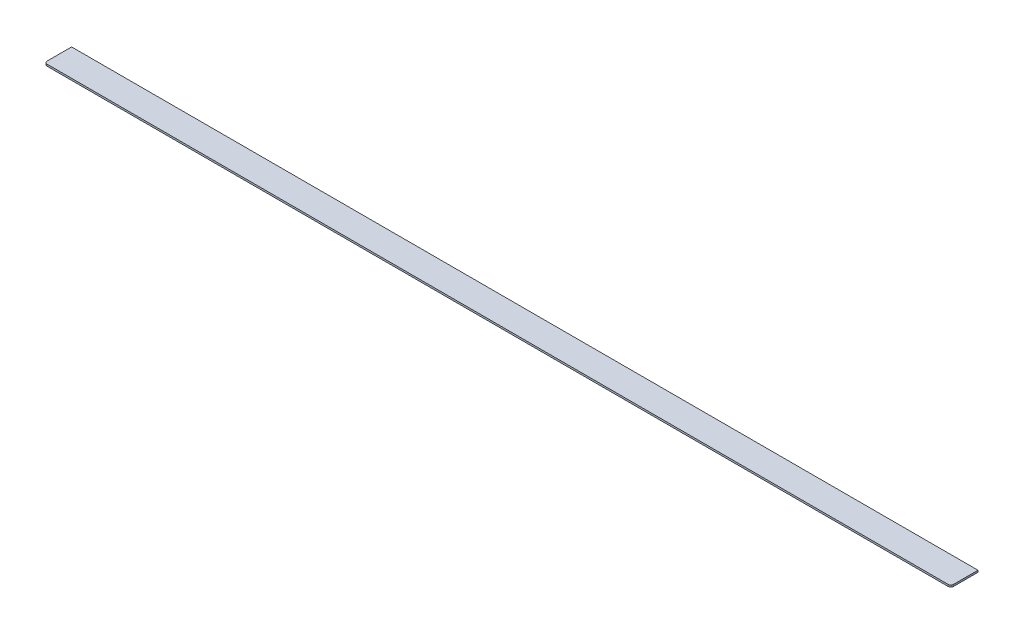
ISO-10303-21;
HEADER;
FILE_DESCRIPTION(('STEP AP214'),'2;1');
FILE_NAME('part.step','',(''),(''),'','','');
FILE_SCHEMA(('AUTOMOTIVE_DESIGN { 1 0 10303 214 1 1 1 1 }'));
ENDSEC;
DATA;
#1=APPLICATION_CONTEXT('core data for automotive mechanical design processes');
#2=APPLICATION_PROTOCOL_DEFINITION('international standard','automotive_design',2000,#1);
#3=PRODUCT_CONTEXT('',#1,'mechanical');
#4=PRODUCT('Part','Part','',(#3));
#5=PRODUCT_RELATED_PRODUCT_CATEGORY('part','',(#4));
#6=PRODUCT_DEFINITION_FORMATION('','',#4);
#7=PRODUCT_DEFINITION_CONTEXT('part definition',#1,'design');
#8=PRODUCT_DEFINITION('design','',#6,#7);
#9=PRODUCT_DEFINITION_SHAPE('','',#8);
#10=(LENGTH_UNIT() NAMED_UNIT(*) SI_UNIT(.MILLI.,.METRE.));
#11=(NAMED_UNIT(*) PLANE_ANGLE_UNIT() SI_UNIT($,.RADIAN.));
#12=(NAMED_UNIT(*) SI_UNIT($,.STERADIAN.) SOLID_ANGLE_UNIT());
#13=UNCERTAINTY_MEASURE_WITH_UNIT(LENGTH_MEASURE(1.E-05),#10,'distance_accuracy_value','');
#14=(GEOMETRIC_REPRESENTATION_CONTEXT(3) GLOBAL_UNCERTAINTY_ASSIGNED_CONTEXT((#13)) GLOBAL_UNIT_ASSIGNED_CONTEXT((#10,
#11,#12)) REPRESENTATION_CONTEXT('',''));
#15=CARTESIAN_POINT('',(0.,0.,0.));
#16=DIRECTION('',(0.,0.,1.));
#17=DIRECTION('',(1.,0.,0.));
#18=AXIS2_PLACEMENT_3D('',#15,#16,#17);
#19=CARTESIAN_POINT('',(1000.,-2.,-3.00000000000002));
#20=DIRECTION('',(1.,0.,0.));
#21=DIRECTION('',(0.,0.,-1.));
#22=AXIS2_PLACEMENT_3D('',#19,#20,#21);
#23=PLANE('',#22);
#24=DIRECTION('',(0.,0.,-1.));
#25=VECTOR('',#24,1.);
#26=CARTESIAN_POINT('',(1000.,0.,-3.00000000000002));
#27=LINE('',#26,#25);
#28=CARTESIAN_POINT('',(1000.,0.,-3.00000000000002));
#29=VERTEX_POINT('',#28);
#30=CARTESIAN_POINT('',(1000.,0.,-30.));
#31=VERTEX_POINT('',#30);
#32=EDGE_CURVE('E129',#29,#31,#27,.T.);
#33=ORIENTED_EDGE('',*,*,#32,.F.);
#34=DIRECTION('',(0.,1.,0.));
#35=VECTOR('',#34,1.);
#36=CARTESIAN_POINT('',(1000.,-2.,-3.00000000000002));
#37=LINE('',#36,#35);
#38=CARTESIAN_POINT('',(1000.,-2.,-3.00000000000002));
#39=VERTEX_POINT('',#38);
#40=EDGE_CURVE('E11',#39,#29,#37,.T.);
#41=ORIENTED_EDGE('',*,*,#40,.F.);
#42=DIRECTION('',(0.,0.,-1.));
#43=VECTOR('',#42,1.);
#44=CARTESIAN_POINT('',(1000.,-2.,-3.00000000000002));
#45=LINE('',#44,#43);
#46=CARTESIAN_POINT('',(1000.,-2.,-30.));
#47=VERTEX_POINT('',#46);
#48=EDGE_CURVE('E143',#39,#47,#45,.T.);
#49=ORIENTED_EDGE('',*,*,#48,.T.);
#50=DIRECTION('',(0.,1.,0.));
#51=VECTOR('',#50,1.);
#52=CARTESIAN_POINT('',(1000.,-2.,-30.));
#53=LINE('',#52,#51);
#54=EDGE_CURVE('E47',#47,#31,#53,.T.);
#55=ORIENTED_EDGE('',*,*,#54,.T.);
#56=EDGE_LOOP('',(#33,#41,#49,#55));
#57=FACE_BOUND('',#56,.T.);
#58=ADVANCED_FACE('F44',(#57),#23,.T.);
#59=CARTESIAN_POINT('',(997.,-2.,-3.));
#60=DIRECTION('',(0.,1.,0.));
#61=DIRECTION('',(0.,0.,1.));
#62=AXIS2_PLACEMENT_3D('',#59,#60,#61);
#63=CYLINDRICAL_SURFACE('',#62,3.);
#64=CARTESIAN_POINT('',(997.,0.,-3.));
#65=DIRECTION('',(0.,1.,0.));
#66=DIRECTION('',(0.,0.,1.));
#67=AXIS2_PLACEMENT_3D('',#64,#65,#66);
#68=CIRCLE('',#67,3.);
#69=CARTESIAN_POINT('',(997.,0.,0.));
#70=VERTEX_POINT('',#69);
#71=EDGE_CURVE('E141',#70,#29,#68,.T.);
#72=ORIENTED_EDGE('',*,*,#71,.F.);
#73=DIRECTION('',(0.,1.,0.));
#74=VECTOR('',#73,1.);
#75=CARTESIAN_POINT('',(997.,-2.,0.));
#76=LINE('',#75,#74);
#77=CARTESIAN_POINT('',(997.,-2.,0.));
#78=VERTEX_POINT('',#77);
#79=EDGE_CURVE('E53',#78,#70,#76,.T.);
#80=ORIENTED_EDGE('',*,*,#79,.F.);
#81=CARTESIAN_POINT('',(997.,-2.,-3.));
#82=DIRECTION('',(0.,1.,0.));
#83=DIRECTION('',(0.,0.,1.));
#84=AXIS2_PLACEMENT_3D('',#81,#82,#83);
#85=CIRCLE('',#84,3.);
#86=EDGE_CURVE('E119',#78,#39,#85,.T.);
#87=ORIENTED_EDGE('',*,*,#86,.T.);
#88=ORIENTED_EDGE('',*,*,#40,.T.);
#89=EDGE_LOOP('',(#72,#80,#87,#88));
#90=FACE_BOUND('',#89,.T.);
#91=ADVANCED_FACE('F151',(#90),#63,.T.);
#92=CARTESIAN_POINT('',(3.00000000000002,-2.,0.));
#93=DIRECTION('',(0.,0.,1.));
#94=DIRECTION('',(1.,0.,0.));
#95=AXIS2_PLACEMENT_3D('',#92,#93,#94);
#96=PLANE('',#95);
#97=DIRECTION('',(1.,0.,0.));
#98=VECTOR('',#97,1.);
#99=CARTESIAN_POINT('',(3.00000000000002,0.,0.));
#100=LINE('',#99,#98);
#101=CARTESIAN_POINT('',(3.00000000000002,0.,0.));
#102=VERTEX_POINT('',#101);
#103=EDGE_CURVE('E106',#102,#70,#100,.T.);
#104=ORIENTED_EDGE('',*,*,#103,.F.);
#105=DIRECTION('',(0.,1.,0.));
#106=VECTOR('',#105,1.);
#107=CARTESIAN_POINT('',(3.00000000000002,-2.,0.));
#108=LINE('',#107,#106);
#109=CARTESIAN_POINT('',(3.00000000000002,-2.,0.));
#110=VERTEX_POINT('',#109);
#111=EDGE_CURVE('E101',#110,#102,#108,.T.);
#112=ORIENTED_EDGE('',*,*,#111,.F.);
#113=DIRECTION('',(1.,0.,0.));
#114=VECTOR('',#113,1.);
#115=CARTESIAN_POINT('',(3.00000000000002,-2.,0.));
#116=LINE('',#115,#114);
#117=EDGE_CURVE('E104',#110,#78,#116,.T.);
#118=ORIENTED_EDGE('',*,*,#117,.T.);
#119=ORIENTED_EDGE('',*,*,#79,.T.);
#120=EDGE_LOOP('',(#104,#112,#118,#119));
#121=FACE_BOUND('',#120,.T.);
#122=ADVANCED_FACE('F103',(#121),#96,.T.);
#123=CARTESIAN_POINT('',(3.,-2.,-3.));
#124=DIRECTION('',(0.,1.,0.));
#125=DIRECTION('',(0.,0.,1.));
#126=AXIS2_PLACEMENT_3D('',#123,#124,#125);
#127=CYLINDRICAL_SURFACE('',#126,3.);
#128=CARTESIAN_POINT('',(3.,0.,-3.));
#129=DIRECTION('',(0.,1.,0.));
#130=DIRECTION('',(0.,0.,-1.));
#131=AXIS2_PLACEMENT_3D('',#128,#129,#130);
#132=CIRCLE('',#131,3.);
#133=CARTESIAN_POINT('',(0.,0.,-3.00000000000002));
#134=VERTEX_POINT('',#133);
#135=EDGE_CURVE('E138',#134,#102,#132,.T.);
#136=ORIENTED_EDGE('',*,*,#135,.F.);
#137=DIRECTION('',(0.,1.,0.));
#138=VECTOR('',#137,1.);
#139=CARTESIAN_POINT('',(0.,-2.,-3.00000000000002));
#140=LINE('',#139,#138);
#141=CARTESIAN_POINT('',(0.,-2.,-3.00000000000002));
#142=VERTEX_POINT('',#141);
#143=EDGE_CURVE('E111',#142,#134,#140,.T.);
#144=ORIENTED_EDGE('',*,*,#143,.F.);
#145=CARTESIAN_POINT('',(3.,-2.,-3.));
#146=DIRECTION('',(0.,1.,0.));
#147=DIRECTION('',(0.,0.,-1.));
#148=AXIS2_PLACEMENT_3D('',#145,#146,#147);
#149=CIRCLE('',#148,3.);
#150=EDGE_CURVE('E117',#142,#110,#149,.T.);
#151=ORIENTED_EDGE('',*,*,#150,.T.);
#152=ORIENTED_EDGE('',*,*,#111,.T.);
#153=EDGE_LOOP('',(#136,#144,#151,#152));
#154=FACE_BOUND('',#153,.T.);
#155=ADVANCED_FACE('F121',(#154),#127,.T.);
#156=CARTESIAN_POINT('',(0.,-2.,-3.00000000000002));
#157=DIRECTION('',(-1.,0.,0.));
#158=DIRECTION('',(0.,0.,1.));
#159=AXIS2_PLACEMENT_3D('',#156,#157,#158);
#160=PLANE('',#159);
#161=DIRECTION('',(0.,0.,1.));
#162=VECTOR('',#161,1.);
#163=CARTESIAN_POINT('',(0.,0.,-3.00000000000002));
#164=LINE('',#163,#162);
#165=CARTESIAN_POINT('',(0.,0.,-30.));
#166=VERTEX_POINT('',#165);
#167=EDGE_CURVE('E135',#166,#134,#164,.T.);
#168=ORIENTED_EDGE('',*,*,#167,.F.);
#169=DIRECTION('',(0.,1.,0.));
#170=VECTOR('',#169,1.);
#171=CARTESIAN_POINT('',(0.,-2.,-30.));
#172=LINE('',#171,#170);
#173=CARTESIAN_POINT('',(0.,-2.,-30.));
#174=VERTEX_POINT('',#173);
#175=EDGE_CURVE('E146',#174,#166,#172,.T.);
#176=ORIENTED_EDGE('',*,*,#175,.F.);
#177=DIRECTION('',(0.,0.,1.));
#178=VECTOR('',#177,1.);
#179=CARTESIAN_POINT('',(0.,-2.,-3.00000000000002));
#180=LINE('',#179,#178);
#181=EDGE_CURVE('E122',#174,#142,#180,.T.);
#182=ORIENTED_EDGE('',*,*,#181,.T.);
#183=ORIENTED_EDGE('',*,*,#143,.T.);
#184=EDGE_LOOP('',(#168,#176,#182,#183));
#185=FACE_BOUND('',#184,.T.);
#186=ADVANCED_FACE('F164',(#185),#160,.T.);
#187=CARTESIAN_POINT('',(0.,-2.,-30.));
#188=DIRECTION('',(0.,0.,-1.));
#189=DIRECTION('',(-1.,0.,0.));
#190=AXIS2_PLACEMENT_3D('',#187,#188,#189);
#191=PLANE('',#190);
#192=DIRECTION('',(-1.,0.,0.));
#193=VECTOR('',#192,1.);
#194=CARTESIAN_POINT('',(0.,0.,-30.));
#195=LINE('',#194,#193);
#196=EDGE_CURVE('E132',#31,#166,#195,.T.);
#197=ORIENTED_EDGE('',*,*,#196,.F.);
#198=ORIENTED_EDGE('',*,*,#54,.F.);
#199=DIRECTION('',(-1.,0.,0.));
#200=VECTOR('',#199,1.);
#201=CARTESIAN_POINT('',(0.,-2.,-30.));
#202=LINE('',#201,#200);
#203=EDGE_CURVE('E124',#47,#174,#202,.T.);
#204=ORIENTED_EDGE('',*,*,#203,.T.);
#205=ORIENTED_EDGE('',*,*,#175,.T.);
#206=EDGE_LOOP('',(#197,#198,#204,#205));
#207=FACE_BOUND('',#206,.T.);
#208=ADVANCED_FACE('F148',(#207),#191,.T.);
#209=CARTESIAN_POINT('',(3.,-2.,-3.));
#210=DIRECTION('',(0.,-1.,0.));
#211=DIRECTION('',(0.,0.,-1.));
#212=AXIS2_PLACEMENT_3D('',#209,#210,#211);
#213=PLANE('',#212);
#214=ORIENTED_EDGE('',*,*,#48,.F.);
#215=ORIENTED_EDGE('',*,*,#86,.F.);
#216=ORIENTED_EDGE('',*,*,#117,.F.);
#217=ORIENTED_EDGE('',*,*,#150,.F.);
#218=ORIENTED_EDGE('',*,*,#181,.F.);
#219=ORIENTED_EDGE('',*,*,#203,.F.);
#220=EDGE_LOOP('',(#214,#215,#216,#217,#218,#219));
#221=FACE_BOUND('',#220,.T.);
#222=ADVANCED_FACE('F115',(#221),#213,.T.);
#223=CARTESIAN_POINT('',(3.,0.,-3.));
#224=DIRECTION('',(0.,-1.,0.));
#225=DIRECTION('',(0.,0.,-1.));
#226=AXIS2_PLACEMENT_3D('',#223,#224,#225);
#227=PLANE('',#226);
#228=ORIENTED_EDGE('',*,*,#32,.T.);
#229=ORIENTED_EDGE('',*,*,#196,.T.);
#230=ORIENTED_EDGE('',*,*,#167,.T.);
#231=ORIENTED_EDGE('',*,*,#135,.T.);
#232=ORIENTED_EDGE('',*,*,#103,.T.);
#233=ORIENTED_EDGE('',*,*,#71,.T.);
#234=EDGE_LOOP('',(#228,#229,#230,#231,#232,#233));
#235=FACE_BOUND('',#234,.T.);
#236=ADVANCED_FACE('F150',(#235),#227,.F.);
#237=CLOSED_SHELL('',(#58,#91,#122,#155,#186,#208,#222,#236));
#238=MANIFOLD_SOLID_BREP('B2',#237);
#239=ADVANCED_BREP_SHAPE_REPRESENTATION('',(#18,#238),#14);
#240=SHAPE_DEFINITION_REPRESENTATION(#9,#239);
ENDSEC;
END-ISO-10303-21;
